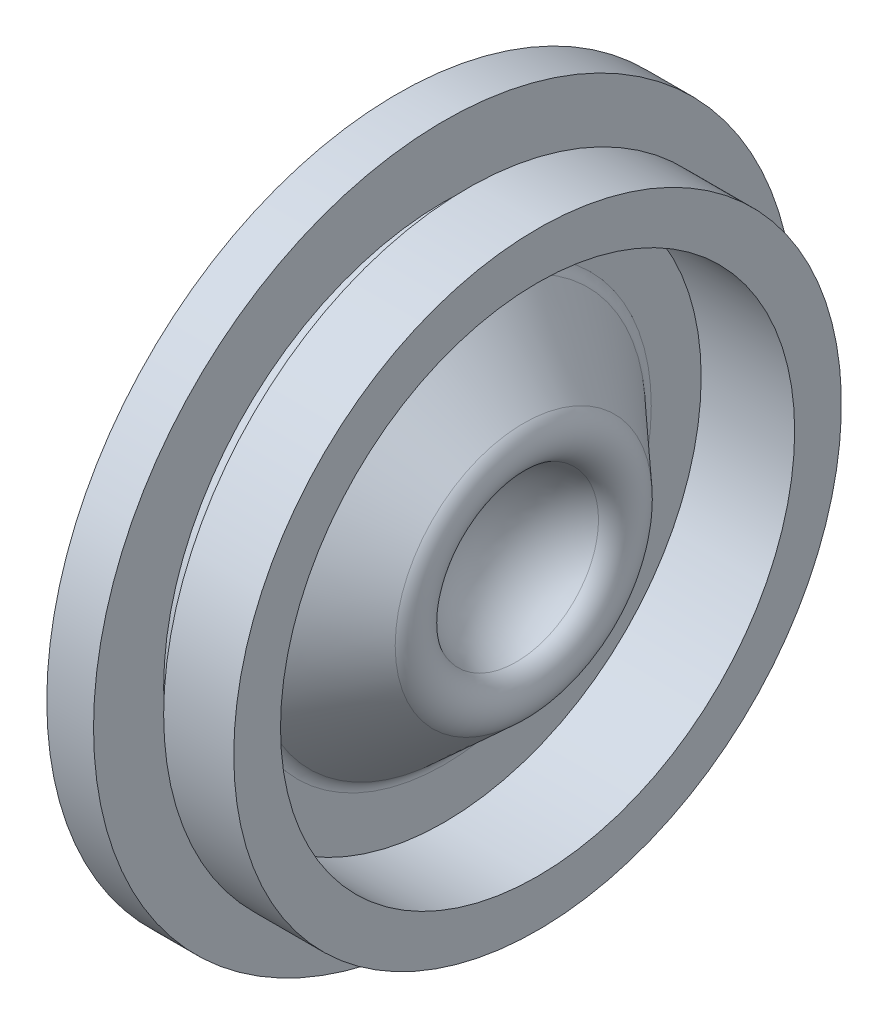
ISO-10303-21;
HEADER;
FILE_DESCRIPTION(('STEP AP214'),'2;1');
FILE_NAME('part.step','',(''),(''),'','','');
FILE_SCHEMA(('AUTOMOTIVE_DESIGN { 1 0 10303 214 1 1 1 1 }'));
ENDSEC;
DATA;
#1=APPLICATION_CONTEXT('core data for automotive mechanical design processes');
#2=APPLICATION_PROTOCOL_DEFINITION('international standard','automotive_design',2000,#1);
#3=PRODUCT_CONTEXT('',#1,'mechanical');
#4=PRODUCT('Part','Part','',(#3));
#5=PRODUCT_RELATED_PRODUCT_CATEGORY('part','',(#4));
#6=PRODUCT_DEFINITION_FORMATION('','',#4);
#7=PRODUCT_DEFINITION_CONTEXT('part definition',#1,'design');
#8=PRODUCT_DEFINITION('design','',#6,#7);
#9=PRODUCT_DEFINITION_SHAPE('','',#8);
#10=(LENGTH_UNIT() NAMED_UNIT(*) SI_UNIT(.MILLI.,.METRE.));
#11=(NAMED_UNIT(*) PLANE_ANGLE_UNIT() SI_UNIT($,.RADIAN.));
#12=(NAMED_UNIT(*) SI_UNIT($,.STERADIAN.) SOLID_ANGLE_UNIT());
#13=UNCERTAINTY_MEASURE_WITH_UNIT(LENGTH_MEASURE(1.E-05),#10,'distance_accuracy_value','');
#14=(GEOMETRIC_REPRESENTATION_CONTEXT(3) GLOBAL_UNCERTAINTY_ASSIGNED_CONTEXT((#13)) GLOBAL_UNIT_ASSIGNED_CONTEXT((#10,
#11,#12)) REPRESENTATION_CONTEXT('',''));
#15=CARTESIAN_POINT('',(0.,0.,0.));
#16=DIRECTION('',(0.,0.,1.));
#17=DIRECTION('',(1.,0.,0.));
#18=AXIS2_PLACEMENT_3D('',#15,#16,#17);
#19=CARTESIAN_POINT('',(5.89997461162972,-1.11022302462516E-13,-2.22044604925031E-13));
#20=DIRECTION('',(0.,0.,-1.));
#21=DIRECTION('',(1.,0.,0.));
#22=AXIS2_PLACEMENT_3D('',#19,#20,#21);
#23=SPHERICAL_SURFACE('',#22,4.88397461162975);
#24=CARTESIAN_POINT('',(3.91987281443607,0.,0.));
#25=DIRECTION('',(-1.,0.,0.));
#26=DIRECTION('',(0.,0.,1.));
#27=AXIS2_PLACEMENT_3D('',#24,#25,#26);
#28=CIRCLE('',#27,4.46457219448796);
#29=CARTESIAN_POINT('',(3.91987281443607,0.,4.46457219448797));
#30=VERTEX_POINT('',#29);
#31=EDGE_CURVE('E161',#30,#30,#28,.T.);
#32=ORIENTED_EDGE('',*,*,#31,.F.);
#33=EDGE_LOOP('',(#32));
#34=FACE_BOUND('',#33,.T.);
#35=ADVANCED_FACE('F17',(#34),#23,.F.);
#36=CARTESIAN_POINT('',(3.30200000000003,-2.22044604925031E-13,2.22044604925031E-13));
#37=DIRECTION('',(-1.,0.,0.));
#38=DIRECTION('',(0.,0.,1.));
#39=AXIS2_PLACEMENT_3D('',#36,#37,#38);
#40=TOROIDAL_SURFACE('',#39,5.85770147247322,1.524);
#41=ORIENTED_EDGE('',*,*,#31,.T.);
#42=EDGE_LOOP('',(#41));
#43=FACE_BOUND('',#42,.T.);
#44=CARTESIAN_POINT('',(4.3275603491929,-2.22044604925031E-13,6.66133814775094E-13));
#45=DIRECTION('',(-1.,0.,0.));
#46=DIRECTION('',(0.,0.,1.));
#47=AXIS2_PLACEMENT_3D('',#44,#45,#46);
#48=CIRCLE('',#47,6.985);
#49=CARTESIAN_POINT('',(4.32756034919291,-2.25146568055834E-13,6.98500000000067));
#50=VERTEX_POINT('',#49);
#51=EDGE_CURVE('E158',#50,#50,#48,.T.);
#52=ORIENTED_EDGE('',*,*,#51,.F.);
#53=EDGE_LOOP('',(#52));
#54=FACE_BOUND('',#53,.T.);
#55=ADVANCED_FACE('F164',(#43,#54),#40,.T.);
#56=CARTESIAN_POINT('',(0.249219825403602,1.11022302462516E-13,2.22044604925031E-13));
#57=DIRECTION('',(-1.,0.,0.));
#58=DIRECTION('',(0.,0.,1.));
#59=AXIS2_PLACEMENT_3D('',#56,#57,#58);
#60=CONICAL_SURFACE('',#59,10.6952721502551,0.738176050859683);
#61=ORIENTED_EDGE('',*,*,#51,.T.);
#62=EDGE_LOOP('',(#61));
#63=FACE_BOUND('',#62,.T.);
#64=CARTESIAN_POINT('',(0.249219825403602,1.11022302462516E-13,2.22044604925031E-13));
#65=DIRECTION('',(-1.,0.,0.));
#66=DIRECTION('',(0.,0.,1.));
#67=AXIS2_PLACEMENT_3D('',#64,#65,#66);
#68=CIRCLE('',#67,10.6952721502551);
#69=CARTESIAN_POINT('',(0.249219825403605,1.06272647504177E-13,10.6952721502553));
#70=VERTEX_POINT('',#69);
#71=EDGE_CURVE('E58',#70,#70,#68,.F.);
#72=ORIENTED_EDGE('',*,*,#71,.T.);
#73=EDGE_LOOP('',(#72));
#74=FACE_BOUND('',#73,.T.);
#75=ADVANCED_FACE('F166',(#63,#74),#60,.T.);
#76=CARTESIAN_POINT('',(0.762000000000044,0.,2.22044604925031E-13));
#77=DIRECTION('',(-1.,0.,0.));
#78=DIRECTION('',(0.,0.,1.));
#79=AXIS2_PLACEMENT_3D('',#76,#77,#78);
#80=TOROIDAL_SURFACE('',#79,11.2589214140182,0.762);
#81=ORIENTED_EDGE('',*,*,#71,.F.);
#82=EDGE_LOOP('',(#81));
#83=FACE_BOUND('',#82,.T.);
#84=CARTESIAN_POINT('',(0.,0.,2.21807780295009E-13));
#85=DIRECTION('',(1.,0.,0.));
#86=DIRECTION('',(0.,0.,1.));
#87=AXIS2_PLACEMENT_3D('',#84,#85,#86);
#88=CIRCLE('',#87,11.2589214140182);
#89=CARTESIAN_POINT('',(0.,-2.22044604925031E-13,-11.2589214140184));
#90=VERTEX_POINT('',#89);
#91=CARTESIAN_POINT('',(0.,-1.11022302462516E-13,11.2589214140189));
#92=VERTEX_POINT('',#91);
#93=EDGE_CURVE('E48',#90,#92,#88,.F.);
#94=ORIENTED_EDGE('',*,*,#93,.F.);
#95=CARTESIAN_POINT('',(0.,0.,2.21807780295009E-13));
#96=DIRECTION('',(1.,0.,0.));
#97=DIRECTION('',(0.,0.,-1.));
#98=AXIS2_PLACEMENT_3D('',#95,#96,#97);
#99=CIRCLE('',#98,11.2589214140182);
#100=EDGE_CURVE('E45',#92,#90,#99,.F.);
#101=ORIENTED_EDGE('',*,*,#100,.F.);
#102=EDGE_LOOP('',(#94,#101));
#103=FACE_BOUND('',#102,.T.);
#104=ADVANCED_FACE('F57',(#83,#103),#80,.F.);
#105=CARTESIAN_POINT('',(0.,-2.22044604925031E-13,-11.2589214140184));
#106=DIRECTION('',(1.,0.,0.));
#107=DIRECTION('',(0.,0.,-1.));
#108=AXIS2_PLACEMENT_3D('',#105,#106,#107);
#109=PLANE('',#108);
#110=ORIENTED_EDGE('',*,*,#100,.T.);
#111=ORIENTED_EDGE('',*,*,#93,.T.);
#112=EDGE_LOOP('',(#110,#111));
#113=FACE_BOUND('',#112,.T.);
#114=CARTESIAN_POINT('',(0.,0.,0.));
#115=DIRECTION('',(-1.,0.,0.));
#116=DIRECTION('',(0.,0.,1.));
#117=AXIS2_PLACEMENT_3D('',#114,#115,#116);
#118=CIRCLE('',#117,13.97);
#119=CARTESIAN_POINT('',(0.,0.,13.97));
#120=VERTEX_POINT('',#119);
#121=EDGE_CURVE('E54',#120,#120,#118,.F.);
#122=ORIENTED_EDGE('',*,*,#121,.T.);
#123=EDGE_LOOP('',(#122));
#124=FACE_BOUND('',#123,.T.);
#125=ADVANCED_FACE('F50',(#113,#124),#109,.T.);
#126=CARTESIAN_POINT('',(5.07999999999997,1.11022302462516E-13,2.22044604925031E-13));
#127=DIRECTION('',(-1.,0.,0.));
#128=DIRECTION('',(0.,0.,1.));
#129=AXIS2_PLACEMENT_3D('',#126,#127,#128);
#130=CYLINDRICAL_SURFACE('',#129,13.97);
#131=CARTESIAN_POINT('',(5.07999999999997,1.11022302462516E-13,2.22044604925031E-13));
#132=DIRECTION('',(-1.,0.,0.));
#133=DIRECTION('',(0.,0.,1.));
#134=AXIS2_PLACEMENT_3D('',#131,#132,#133);
#135=CIRCLE('',#134,13.97);
#136=CARTESIAN_POINT('',(5.07999999999998,1.0481837620091E-13,13.9700000000002));
#137=VERTEX_POINT('',#136);
#138=EDGE_CURVE('E215',#137,#137,#135,.T.);
#139=ORIENTED_EDGE('',*,*,#138,.F.);
#140=EDGE_LOOP('',(#139));
#141=FACE_BOUND('',#140,.T.);
#142=ORIENTED_EDGE('',*,*,#121,.F.);
#143=EDGE_LOOP('',(#142));
#144=FACE_BOUND('',#143,.T.);
#145=ADVANCED_FACE('F121',(#141,#144),#130,.F.);
#146=CARTESIAN_POINT('',(5.07999999999997,1.11022302462516E-13,2.22044604925031E-13));
#147=DIRECTION('',(1.,0.,0.));
#148=DIRECTION('',(0.,0.,-1.));
#149=AXIS2_PLACEMENT_3D('',#146,#147,#148);
#150=PLANE('',#149);
#151=ORIENTED_EDGE('',*,*,#138,.T.);
#152=EDGE_LOOP('',(#151));
#153=FACE_BOUND('',#152,.T.);
#154=CARTESIAN_POINT('',(5.07999999999997,1.11022302462516E-13,2.22044604925031E-13));
#155=DIRECTION('',(-1.,0.,0.));
#156=DIRECTION('',(0.,0.,1.));
#157=AXIS2_PLACEMENT_3D('',#154,#155,#156);
#158=CIRCLE('',#157,16.51);
#159=CARTESIAN_POINT('',(5.07999999999998,1.03690389607891E-13,16.5100000000002));
#160=VERTEX_POINT('',#159);
#161=EDGE_CURVE('E212',#160,#160,#158,.T.);
#162=ORIENTED_EDGE('',*,*,#161,.F.);
#163=EDGE_LOOP('',(#162));
#164=FACE_BOUND('',#163,.T.);
#165=ADVANCED_FACE('F117',(#153,#164),#150,.T.);
#166=CARTESIAN_POINT('',(5.07999999999997,1.11022302462516E-13,2.22044604925031E-13));
#167=DIRECTION('',(-1.,0.,0.));
#168=DIRECTION('',(0.,0.,1.));
#169=AXIS2_PLACEMENT_3D('',#166,#167,#168);
#170=CYLINDRICAL_SURFACE('',#169,16.51);
#171=ORIENTED_EDGE('',*,*,#161,.T.);
#172=EDGE_LOOP('',(#171));
#173=FACE_BOUND('',#172,.T.);
#174=CARTESIAN_POINT('',(1.27000000000033,2.22044604925031E-13,0.));
#175=DIRECTION('',(-1.,0.,0.));
#176=DIRECTION('',(0.,0.,1.));
#177=AXIS2_PLACEMENT_3D('',#174,#175,#176);
#178=CIRCLE('',#177,16.51);
#179=CARTESIAN_POINT('',(1.27000000000033,2.14712692070407E-13,16.51));
#180=VERTEX_POINT('',#179);
#181=EDGE_CURVE('E209',#180,#180,#178,.T.);
#182=ORIENTED_EDGE('',*,*,#181,.F.);
#183=EDGE_LOOP('',(#182));
#184=FACE_BOUND('',#183,.T.);
#185=ADVANCED_FACE('F113',(#173,#184),#170,.T.);
#186=CARTESIAN_POINT('',(1.26999999999988,21.59,2.22044604925031E-13));
#187=DIRECTION('',(-1.,0.,0.));
#188=DIRECTION('',(0.,0.,1.));
#189=AXIS2_PLACEMENT_3D('',#186,#187,#188);
#190=PLANE('',#189);
#191=ORIENTED_EDGE('',*,*,#181,.T.);
#192=EDGE_LOOP('',(#191));
#193=FACE_BOUND('',#192,.T.);
#194=CARTESIAN_POINT('',(1.27000000000033,2.22044604925031E-13,0.));
#195=DIRECTION('',(-1.,0.,0.));
#196=DIRECTION('',(0.,0.,1.));
#197=AXIS2_PLACEMENT_3D('',#194,#195,#196);
#198=CIRCLE('',#197,15.24);
#199=CARTESIAN_POINT('',(1.27000000000033,2.15276685366916E-13,15.24));
#200=VERTEX_POINT('',#199);
#201=EDGE_CURVE('E206',#200,#200,#198,.T.);
#202=ORIENTED_EDGE('',*,*,#201,.F.);
#203=EDGE_LOOP('',(#202));
#204=FACE_BOUND('',#203,.T.);
#205=ADVANCED_FACE('F109',(#193,#204),#190,.T.);
#206=CARTESIAN_POINT('',(5.89997461162972,-1.11022302462516E-13,-2.22044604925031E-13));
#207=DIRECTION('',(0.,0.,-1.));
#208=DIRECTION('',(1.,0.,0.));
#209=AXIS2_PLACEMENT_3D('',#206,#207,#208);
#210=SPHERICAL_SURFACE('',#209,7.42397461162975);
#211=CARTESIAN_POINT('',(1.58806938252209,2.22044604925031E-13,4.44089209850063E-13));
#212=DIRECTION('',(-1.,0.,0.));
#213=DIRECTION('',(0.,0.,1.));
#214=AXIS2_PLACEMENT_3D('',#211,#212,#213);
#215=CIRCLE('',#214,6.04341561778739);
#216=CARTESIAN_POINT('',(1.5880693825221,2.19360789258533E-13,6.04341561778784));
#217=VERTEX_POINT('',#216);
#218=EDGE_CURVE('E203',#217,#217,#215,.T.);
#219=ORIENTED_EDGE('',*,*,#218,.T.);
#220=EDGE_LOOP('',(#219));
#221=FACE_BOUND('',#220,.T.);
#222=ADVANCED_FACE('F104',(#221),#210,.T.);
#223=CARTESIAN_POINT('',(-8.72939273401918,2.22044604925031E-13,0.));
#224=DIRECTION('',(-1.,0.,0.));
#225=DIRECTION('',(0.,0.,1.));
#226=AXIS2_PLACEMENT_3D('',#223,#224,#225);
#227=CYLINDRICAL_SURFACE('',#226,15.24);
#228=ORIENTED_EDGE('',*,*,#201,.T.);
#229=EDGE_LOOP('',(#228));
#230=FACE_BOUND('',#229,.T.);
#231=CARTESIAN_POINT('',(0.,0.,0.));
#232=DIRECTION('',(-1.,0.,0.));
#233=DIRECTION('',(0.,0.,1.));
#234=AXIS2_PLACEMENT_3D('',#231,#232,#233);
#235=CIRCLE('',#234,15.24);
#236=CARTESIAN_POINT('',(0.,0.,15.24));
#237=VERTEX_POINT('',#236);
#238=EDGE_CURVE('E101',#237,#237,#235,.T.);
#239=ORIENTED_EDGE('',*,*,#238,.F.);
#240=EDGE_LOOP('',(#239));
#241=FACE_BOUND('',#240,.T.);
#242=ADVANCED_FACE('F108',(#230,#241),#227,.T.);
#243=CARTESIAN_POINT('',(-1.46004742325134,2.22044604925031E-13,0.));
#244=DIRECTION('',(-1.,0.,0.));
#245=DIRECTION('',(0.,0.,1.));
#246=AXIS2_PLACEMENT_3D('',#243,#244,#245);
#247=CONICAL_SURFACE('',#246,8.81644127104434,0.738176050859682);
#248=ORIENTED_EDGE('',*,*,#218,.F.);
#249=EDGE_LOOP('',(#248));
#250=FACE_BOUND('',#249,.T.);
#251=CARTESIAN_POINT('',(-1.46004742325134,2.22044604925031E-13,0.));
#252=DIRECTION('',(-1.,0.,0.));
#253=DIRECTION('',(0.,0.,1.));
#254=AXIS2_PLACEMENT_3D('',#251,#252,#253);
#255=CIRCLE('',#254,8.81644127104434);
#256=CARTESIAN_POINT('',(-1.46004742325134,2.18129318487284E-13,8.81644127104435));
#257=VERTEX_POINT('',#256);
#258=EDGE_CURVE('E92',#257,#257,#255,.F.);
#259=ORIENTED_EDGE('',*,*,#258,.F.);
#260=EDGE_LOOP('',(#259));
#261=FACE_BOUND('',#260,.T.);
#262=ADVANCED_FACE('F291',(#250,#261),#247,.F.);
#263=CARTESIAN_POINT('',(0.,-2.22044604925031E-13,-11.2589214140184));
#264=DIRECTION('',(1.,0.,0.));
#265=DIRECTION('',(0.,0.,-1.));
#266=AXIS2_PLACEMENT_3D('',#263,#264,#265);
#267=PLANE('',#266);
#268=ORIENTED_EDGE('',*,*,#238,.T.);
#269=EDGE_LOOP('',(#268));
#270=FACE_BOUND('',#269,.T.);
#271=CARTESIAN_POINT('',(0.,0.,0.));
#272=DIRECTION('',(-1.,0.,0.));
#273=DIRECTION('',(0.,0.,1.));
#274=AXIS2_PLACEMENT_3D('',#271,#272,#273);
#275=CIRCLE('',#274,19.05);
#276=CARTESIAN_POINT('',(0.,0.,19.05));
#277=VERTEX_POINT('',#276);
#278=EDGE_CURVE('E100',#277,#277,#275,.T.);
#279=ORIENTED_EDGE('',*,*,#278,.F.);
#280=EDGE_LOOP('',(#279));
#281=FACE_BOUND('',#280,.T.);
#282=ADVANCED_FACE('F77',(#270,#281),#267,.T.);
#283=CARTESIAN_POINT('',(0.762000000000044,0.,2.22044604925031E-13));
#284=DIRECTION('',(-1.,0.,0.));
#285=DIRECTION('',(0.,0.,1.));
#286=AXIS2_PLACEMENT_3D('',#283,#284,#285);
#287=TOROIDAL_SURFACE('',#286,11.2589214140182,3.302);
#288=ORIENTED_EDGE('',*,*,#258,.T.);
#289=EDGE_LOOP('',(#288));
#290=FACE_BOUND('',#289,.T.);
#291=CARTESIAN_POINT('',(-2.53999999999996,0.,2.21018364861601E-13));
#292=DIRECTION('',(-1.,0.,0.));
#293=DIRECTION('',(0.,0.,1.));
#294=AXIS2_PLACEMENT_3D('',#291,#292,#293);
#295=CIRCLE('',#294,11.2589214140182);
#296=CARTESIAN_POINT('',(-2.53999999999976,2.22044604925031E-13,11.2589214140184));
#297=VERTEX_POINT('',#296);
#298=CARTESIAN_POINT('',(-2.53999999999999,0.,-11.258921414018));
#299=VERTEX_POINT('',#298);
#300=EDGE_CURVE('E29',#297,#299,#295,.T.);
#301=ORIENTED_EDGE('',*,*,#300,.T.);
#302=CARTESIAN_POINT('',(-2.53999999999996,0.,2.21018364861601E-13));
#303=DIRECTION('',(-1.,0.,0.));
#304=DIRECTION('',(0.,0.,-1.));
#305=AXIS2_PLACEMENT_3D('',#302,#303,#304);
#306=CIRCLE('',#305,11.2589214140182);
#307=EDGE_CURVE('E195',#299,#297,#306,.T.);
#308=ORIENTED_EDGE('',*,*,#307,.T.);
#309=EDGE_LOOP('',(#301,#308));
#310=FACE_BOUND('',#309,.T.);
#311=ADVANCED_FACE('F65',(#290,#310),#287,.T.);
#312=CARTESIAN_POINT('',(-47.0517773316736,2.22044604925031E-13,2.22044604925031E-13));
#313=DIRECTION('',(-1.,0.,0.));
#314=DIRECTION('',(0.,0.,1.));
#315=AXIS2_PLACEMENT_3D('',#312,#313,#314);
#316=CYLINDRICAL_SURFACE('',#315,19.05);
#317=CARTESIAN_POINT('',(-2.54000000000021,1.11022302462516E-13,-2.22044604925031E-13));
#318=DIRECTION('',(-1.,0.,0.));
#319=DIRECTION('',(0.,0.,1.));
#320=AXIS2_PLACEMENT_3D('',#317,#318,#319);
#321=CIRCLE('',#320,19.05);
#322=CARTESIAN_POINT('',(-2.5400000000002,1.02562403014872E-13,19.0499999999998));
#323=VERTEX_POINT('',#322);
#324=EDGE_CURVE('E11',#323,#323,#321,.F.);
#325=ORIENTED_EDGE('',*,*,#324,.T.);
#326=EDGE_LOOP('',(#325));
#327=FACE_BOUND('',#326,.T.);
#328=ORIENTED_EDGE('',*,*,#278,.T.);
#329=EDGE_LOOP('',(#328));
#330=FACE_BOUND('',#329,.T.);
#331=ADVANCED_FACE('F76',(#327,#330),#316,.T.);
#332=CARTESIAN_POINT('',(-2.53999999999999,0.,-11.258921414018));
#333=DIRECTION('',(1.,0.,0.));
#334=DIRECTION('',(0.,0.,-1.));
#335=AXIS2_PLACEMENT_3D('',#332,#333,#334);
#336=PLANE('',#335);
#337=ORIENTED_EDGE('',*,*,#324,.F.);
#338=EDGE_LOOP('',(#337));
#339=FACE_BOUND('',#338,.T.);
#340=ORIENTED_EDGE('',*,*,#307,.F.);
#341=ORIENTED_EDGE('',*,*,#300,.F.);
#342=EDGE_LOOP('',(#340,#341));
#343=FACE_BOUND('',#342,.T.);
#344=ADVANCED_FACE('F176',(#339,#343),#336,.F.);
#345=CLOSED_SHELL('',(#35,#55,#75,#104,#125,#145,#165,#185,#205,#222,#242,#262,#282,#311,#331,#344));
#346=MANIFOLD_SOLID_BREP('B1',#345);
#347=ADVANCED_BREP_SHAPE_REPRESENTATION('',(#18,#346),#14);
#348=SHAPE_DEFINITION_REPRESENTATION(#9,#347);
ENDSEC;
END-ISO-10303-21;
